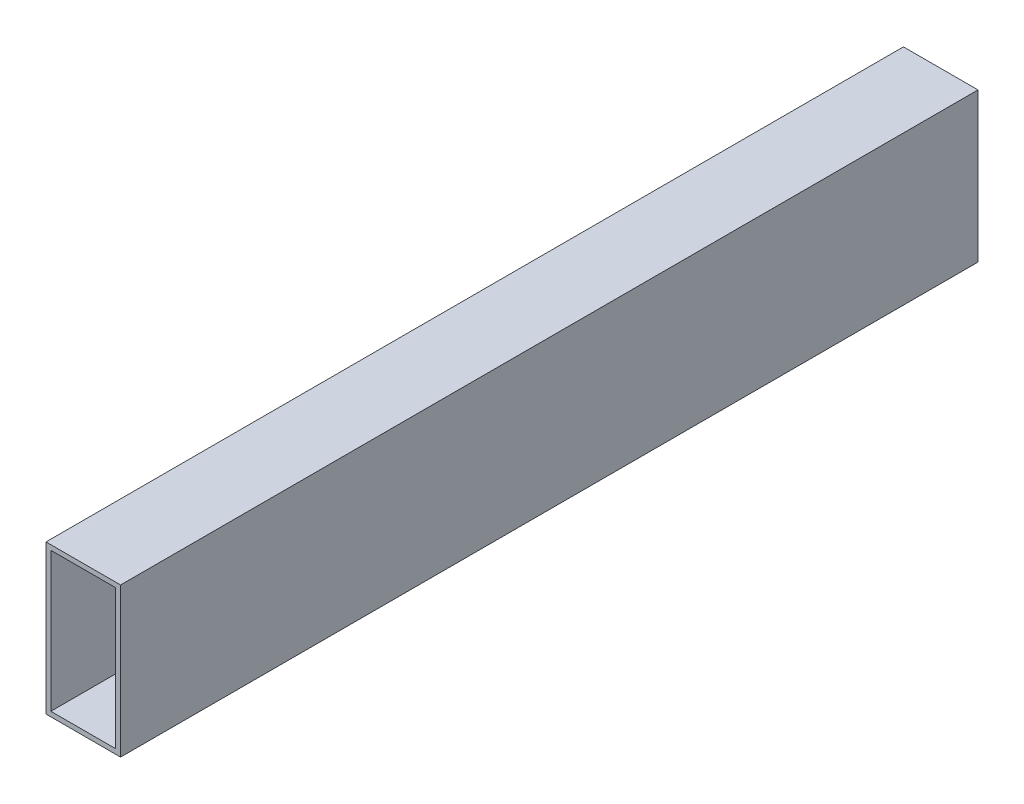
ISO-10303-21;
HEADER;
FILE_DESCRIPTION(('STEP AP214'),'2;1');
FILE_NAME('part.step','',(''),(''),'','','');
FILE_SCHEMA(('AUTOMOTIVE_DESIGN { 1 0 10303 214 1 1 1 1 }'));
ENDSEC;
DATA;
#1=APPLICATION_CONTEXT('core data for automotive mechanical design processes');
#2=APPLICATION_PROTOCOL_DEFINITION('international standard','automotive_design',2000,#1);
#3=PRODUCT_CONTEXT('',#1,'mechanical');
#4=PRODUCT('Part','Part','',(#3));
#5=PRODUCT_RELATED_PRODUCT_CATEGORY('part','',(#4));
#6=PRODUCT_DEFINITION_FORMATION('','',#4);
#7=PRODUCT_DEFINITION_CONTEXT('part definition',#1,'design');
#8=PRODUCT_DEFINITION('design','',#6,#7);
#9=PRODUCT_DEFINITION_SHAPE('','',#8);
#10=(LENGTH_UNIT() NAMED_UNIT(*) SI_UNIT(.MILLI.,.METRE.));
#11=(NAMED_UNIT(*) PLANE_ANGLE_UNIT() SI_UNIT($,.RADIAN.));
#12=(NAMED_UNIT(*) SI_UNIT($,.STERADIAN.) SOLID_ANGLE_UNIT());
#13=UNCERTAINTY_MEASURE_WITH_UNIT(LENGTH_MEASURE(1.E-05),#10,'distance_accuracy_value','');
#14=(GEOMETRIC_REPRESENTATION_CONTEXT(3) GLOBAL_UNCERTAINTY_ASSIGNED_CONTEXT((#13)) GLOBAL_UNIT_ASSIGNED_CONTEXT((#10,
#11,#12)) REPRESENTATION_CONTEXT('',''));
#15=CARTESIAN_POINT('',(0.,0.,0.));
#16=DIRECTION('',(0.,0.,1.));
#17=DIRECTION('',(1.,0.,0.));
#18=AXIS2_PLACEMENT_3D('',#15,#16,#17);
#19=CARTESIAN_POINT('',(-48.4372093023255,-30.1994186046511,292.1));
#20=DIRECTION('',(1.,0.,0.));
#21=DIRECTION('',(0.,0.,-1.));
#22=AXIS2_PLACEMENT_3D('',#19,#20,#21);
#23=PLANE('',#22);
#24=DIRECTION('',(0.,-1.,0.));
#25=VECTOR('',#24,1.);
#26=CARTESIAN_POINT('',(-48.4372093023255,-30.1994186046511,0.));
#27=LINE('',#26,#25);
#28=CARTESIAN_POINT('',(-48.4372093023255,20.6005813953489,0.));
#29=VERTEX_POINT('',#28);
#30=CARTESIAN_POINT('',(-48.4372093023255,-30.1994186046511,0.));
#31=VERTEX_POINT('',#30);
#32=EDGE_CURVE('E129',#29,#31,#27,.T.);
#33=ORIENTED_EDGE('',*,*,#32,.T.);
#34=DIRECTION('',(0.,0.,-1.));
#35=VECTOR('',#34,1.);
#36=CARTESIAN_POINT('',(-48.4372093023255,-30.1994186046511,292.1));
#37=LINE('',#36,#35);
#38=CARTESIAN_POINT('',(-48.4372093023255,-30.1994186046511,292.1));
#39=VERTEX_POINT('',#38);
#40=EDGE_CURVE('E11',#39,#31,#37,.T.);
#41=ORIENTED_EDGE('',*,*,#40,.F.);
#42=DIRECTION('',(0.,-1.,0.));
#43=VECTOR('',#42,1.);
#44=CARTESIAN_POINT('',(-48.4372093023255,-30.1994186046511,292.1));
#45=LINE('',#44,#43);
#46=CARTESIAN_POINT('',(-48.4372093023255,20.6005813953489,292.1));
#47=VERTEX_POINT('',#46);
#48=EDGE_CURVE('E133',#47,#39,#45,.T.);
#49=ORIENTED_EDGE('',*,*,#48,.F.);
#50=DIRECTION('',(0.,0.,-1.));
#51=VECTOR('',#50,1.);
#52=CARTESIAN_POINT('',(-48.4372093023255,20.6005813953489,292.1));
#53=LINE('',#52,#51);
#54=EDGE_CURVE('E143',#47,#29,#53,.T.);
#55=ORIENTED_EDGE('',*,*,#54,.T.);
#56=EDGE_LOOP('',(#33,#41,#49,#55));
#57=FACE_BOUND('',#56,.T.);
#58=ADVANCED_FACE('F32',(#57),#23,.F.);
#59=CARTESIAN_POINT('',(-48.4372093023255,-30.1994186046511,292.1));
#60=DIRECTION('',(0.,1.,0.));
#61=DIRECTION('',(0.,0.,1.));
#62=AXIS2_PLACEMENT_3D('',#59,#60,#61);
#63=PLANE('',#62);
#64=DIRECTION('',(1.,0.,0.));
#65=VECTOR('',#64,1.);
#66=CARTESIAN_POINT('',(-48.4372093023255,-30.1994186046511,0.));
#67=LINE('',#66,#65);
#68=CARTESIAN_POINT('',(-23.0372093023255,-30.1994186046511,0.));
#69=VERTEX_POINT('',#68);
#70=EDGE_CURVE('E146',#31,#69,#67,.T.);
#71=ORIENTED_EDGE('',*,*,#70,.T.);
#72=DIRECTION('',(0.,0.,-1.));
#73=VECTOR('',#72,1.);
#74=CARTESIAN_POINT('',(-23.0372093023255,-30.1994186046511,292.1));
#75=LINE('',#74,#73);
#76=CARTESIAN_POINT('',(-23.0372093023255,-30.1994186046511,292.1));
#77=VERTEX_POINT('',#76);
#78=EDGE_CURVE('E39',#77,#69,#75,.T.);
#79=ORIENTED_EDGE('',*,*,#78,.F.);
#80=DIRECTION('',(1.,0.,0.));
#81=VECTOR('',#80,1.);
#82=CARTESIAN_POINT('',(-48.4372093023255,-30.1994186046511,292.1));
#83=LINE('',#82,#81);
#84=EDGE_CURVE('E136',#39,#77,#83,.T.);
#85=ORIENTED_EDGE('',*,*,#84,.F.);
#86=ORIENTED_EDGE('',*,*,#40,.T.);
#87=EDGE_LOOP('',(#71,#79,#85,#86));
#88=FACE_BOUND('',#87,.T.);
#89=ADVANCED_FACE('F174',(#88),#63,.F.);
#90=CARTESIAN_POINT('',(-23.0372093023255,-30.1994186046511,292.1));
#91=DIRECTION('',(-1.,0.,0.));
#92=DIRECTION('',(0.,-1.,0.));
#93=AXIS2_PLACEMENT_3D('',#90,#91,#92);
#94=PLANE('',#93);
#95=DIRECTION('',(0.,1.,0.));
#96=VECTOR('',#95,1.);
#97=CARTESIAN_POINT('',(-23.0372093023255,-30.1994186046511,0.));
#98=LINE('',#97,#96);
#99=CARTESIAN_POINT('',(-23.0372093023255,20.6005813953489,0.));
#100=VERTEX_POINT('',#99);
#101=EDGE_CURVE('E148',#69,#100,#98,.T.);
#102=ORIENTED_EDGE('',*,*,#101,.T.);
#103=DIRECTION('',(0.,0.,-1.));
#104=VECTOR('',#103,1.);
#105=CARTESIAN_POINT('',(-23.0372093023255,20.6005813953489,292.1));
#106=LINE('',#105,#104);
#107=CARTESIAN_POINT('',(-23.0372093023255,20.6005813953489,292.1));
#108=VERTEX_POINT('',#107);
#109=EDGE_CURVE('E153',#108,#100,#106,.T.);
#110=ORIENTED_EDGE('',*,*,#109,.F.);
#111=DIRECTION('',(0.,1.,0.));
#112=VECTOR('',#111,1.);
#113=CARTESIAN_POINT('',(-23.0372093023255,-30.1994186046511,292.1));
#114=LINE('',#113,#112);
#115=EDGE_CURVE('E139',#77,#108,#114,.T.);
#116=ORIENTED_EDGE('',*,*,#115,.F.);
#117=ORIENTED_EDGE('',*,*,#78,.T.);
#118=EDGE_LOOP('',(#102,#110,#116,#117));
#119=FACE_BOUND('',#118,.T.);
#120=ADVANCED_FACE('F160',(#119),#94,.F.);
#121=CARTESIAN_POINT('',(-48.4372093023255,20.6005813953489,292.1));
#122=DIRECTION('',(0.,-1.,0.));
#123=DIRECTION('',(0.,0.,-1.));
#124=AXIS2_PLACEMENT_3D('',#121,#122,#123);
#125=PLANE('',#124);
#126=DIRECTION('',(-1.,0.,0.));
#127=VECTOR('',#126,1.);
#128=CARTESIAN_POINT('',(-48.4372093023255,20.6005813953489,0.));
#129=LINE('',#128,#127);
#130=EDGE_CURVE('E137',#100,#29,#129,.T.);
#131=ORIENTED_EDGE('',*,*,#130,.T.);
#132=ORIENTED_EDGE('',*,*,#54,.F.);
#133=DIRECTION('',(-1.,0.,0.));
#134=VECTOR('',#133,1.);
#135=CARTESIAN_POINT('',(-48.4372093023255,20.6005813953489,292.1));
#136=LINE('',#135,#134);
#137=EDGE_CURVE('E141',#108,#47,#136,.T.);
#138=ORIENTED_EDGE('',*,*,#137,.F.);
#139=ORIENTED_EDGE('',*,*,#109,.T.);
#140=EDGE_LOOP('',(#131,#132,#138,#139));
#141=FACE_BOUND('',#140,.T.);
#142=ADVANCED_FACE('F167',(#141),#125,.F.);
#143=CARTESIAN_POINT('',(0.,0.,292.1));
#144=DIRECTION('',(0.,0.,-1.));
#145=DIRECTION('',(-1.,0.,0.));
#146=AXIS2_PLACEMENT_3D('',#143,#144,#145);
#147=PLANE('',#146);
#148=DIRECTION('',(-1.,0.,0.));
#149=VECTOR('',#148,1.);
#150=CARTESIAN_POINT('',(-46.7862093023255,18.9495813953489,292.1));
#151=LINE('',#150,#149);
#152=CARTESIAN_POINT('',(-24.6882093023255,18.9495813953489,292.1));
#153=VERTEX_POINT('',#152);
#154=CARTESIAN_POINT('',(-46.7862093023255,18.9495813953489,292.1));
#155=VERTEX_POINT('',#154);
#156=EDGE_CURVE('E123',#153,#155,#151,.T.);
#157=ORIENTED_EDGE('',*,*,#156,.F.);
#158=DIRECTION('',(0.,1.,0.));
#159=VECTOR('',#158,1.);
#160=CARTESIAN_POINT('',(-24.6882093023255,18.9495813953489,292.1));
#161=LINE('',#160,#159);
#162=CARTESIAN_POINT('',(-24.6882093023255,-28.5484186046511,292.1));
#163=VERTEX_POINT('',#162);
#164=EDGE_CURVE('E46',#163,#153,#161,.T.);
#165=ORIENTED_EDGE('',*,*,#164,.F.);
#166=DIRECTION('',(1.,0.,0.));
#167=VECTOR('',#166,1.);
#168=CARTESIAN_POINT('',(-46.7862093023255,-28.5484186046511,292.1));
#169=LINE('',#168,#167);
#170=CARTESIAN_POINT('',(-46.7862093023255,-28.5484186046511,292.1));
#171=VERTEX_POINT('',#170);
#172=EDGE_CURVE('E114',#171,#163,#169,.T.);
#173=ORIENTED_EDGE('',*,*,#172,.F.);
#174=DIRECTION('',(0.,-1.,0.));
#175=VECTOR('',#174,1.);
#176=CARTESIAN_POINT('',(-46.7862093023255,18.9495813953489,292.1));
#177=LINE('',#176,#175);
#178=EDGE_CURVE('E117',#155,#171,#177,.T.);
#179=ORIENTED_EDGE('',*,*,#178,.F.);
#180=EDGE_LOOP('',(#157,#165,#173,#179));
#181=FACE_BOUND('',#180,.T.);
#182=ORIENTED_EDGE('',*,*,#48,.T.);
#183=ORIENTED_EDGE('',*,*,#84,.T.);
#184=ORIENTED_EDGE('',*,*,#115,.T.);
#185=ORIENTED_EDGE('',*,*,#137,.T.);
#186=EDGE_LOOP('',(#182,#183,#184,#185));
#187=FACE_BOUND('',#186,.T.);
#188=ADVANCED_FACE('F173',(#181,#187),#147,.F.);
#189=CARTESIAN_POINT('',(0.,0.,0.));
#190=DIRECTION('',(0.,0.,-1.));
#191=DIRECTION('',(-1.,0.,0.));
#192=AXIS2_PLACEMENT_3D('',#189,#190,#191);
#193=PLANE('',#192);
#194=DIRECTION('',(0.,1.,0.));
#195=VECTOR('',#194,1.);
#196=CARTESIAN_POINT('',(-24.6882093023255,18.9495813953489,0.));
#197=LINE('',#196,#195);
#198=CARTESIAN_POINT('',(-24.6882093023255,-28.5484186046511,0.));
#199=VERTEX_POINT('',#198);
#200=CARTESIAN_POINT('',(-24.6882093023255,18.9495813953489,0.));
#201=VERTEX_POINT('',#200);
#202=EDGE_CURVE('E98',#199,#201,#197,.T.);
#203=ORIENTED_EDGE('',*,*,#202,.T.);
#204=DIRECTION('',(-1.,0.,0.));
#205=VECTOR('',#204,1.);
#206=CARTESIAN_POINT('',(-46.7862093023255,18.9495813953489,0.));
#207=LINE('',#206,#205);
#208=CARTESIAN_POINT('',(-46.7862093023255,18.9495813953489,0.));
#209=VERTEX_POINT('',#208);
#210=EDGE_CURVE('E107',#201,#209,#207,.T.);
#211=ORIENTED_EDGE('',*,*,#210,.T.);
#212=DIRECTION('',(0.,-1.,0.));
#213=VECTOR('',#212,1.);
#214=CARTESIAN_POINT('',(-46.7862093023255,18.9495813953489,0.));
#215=LINE('',#214,#213);
#216=CARTESIAN_POINT('',(-46.7862093023255,-28.5484186046511,0.));
#217=VERTEX_POINT('',#216);
#218=EDGE_CURVE('E54',#209,#217,#215,.T.);
#219=ORIENTED_EDGE('',*,*,#218,.T.);
#220=DIRECTION('',(1.,0.,0.));
#221=VECTOR('',#220,1.);
#222=CARTESIAN_POINT('',(-46.7862093023255,-28.5484186046511,0.));
#223=LINE('',#222,#221);
#224=EDGE_CURVE('E104',#217,#199,#223,.T.);
#225=ORIENTED_EDGE('',*,*,#224,.T.);
#226=EDGE_LOOP('',(#203,#211,#219,#225));
#227=FACE_BOUND('',#226,.T.);
#228=ORIENTED_EDGE('',*,*,#32,.F.);
#229=ORIENTED_EDGE('',*,*,#130,.F.);
#230=ORIENTED_EDGE('',*,*,#101,.F.);
#231=ORIENTED_EDGE('',*,*,#70,.F.);
#232=EDGE_LOOP('',(#228,#229,#230,#231));
#233=FACE_BOUND('',#232,.T.);
#234=ADVANCED_FACE('F111',(#227,#233),#193,.T.);
#235=CARTESIAN_POINT('',(-24.6882093023255,18.9495813953489,0.));
#236=DIRECTION('',(1.,0.,0.));
#237=DIRECTION('',(0.,1.,0.));
#238=AXIS2_PLACEMENT_3D('',#235,#236,#237);
#239=PLANE('',#238);
#240=ORIENTED_EDGE('',*,*,#164,.T.);
#241=DIRECTION('',(0.,0.,1.));
#242=VECTOR('',#241,1.);
#243=CARTESIAN_POINT('',(-24.6882093023255,18.9495813953489,0.));
#244=LINE('',#243,#242);
#245=EDGE_CURVE('E94',#201,#153,#244,.T.);
#246=ORIENTED_EDGE('',*,*,#245,.F.);
#247=ORIENTED_EDGE('',*,*,#202,.F.);
#248=DIRECTION('',(0.,0.,1.));
#249=VECTOR('',#248,1.);
#250=CARTESIAN_POINT('',(-24.6882093023255,-28.5484186046511,0.));
#251=LINE('',#250,#249);
#252=EDGE_CURVE('E127',#199,#163,#251,.T.);
#253=ORIENTED_EDGE('',*,*,#252,.T.);
#254=EDGE_LOOP('',(#240,#246,#247,#253));
#255=FACE_BOUND('',#254,.T.);
#256=ADVANCED_FACE('F96',(#255),#239,.F.);
#257=CARTESIAN_POINT('',(-46.7862093023255,-28.5484186046511,0.));
#258=DIRECTION('',(0.,-1.,0.));
#259=DIRECTION('',(0.,0.,-1.));
#260=AXIS2_PLACEMENT_3D('',#257,#258,#259);
#261=PLANE('',#260);
#262=ORIENTED_EDGE('',*,*,#172,.T.);
#263=ORIENTED_EDGE('',*,*,#252,.F.);
#264=ORIENTED_EDGE('',*,*,#224,.F.);
#265=DIRECTION('',(0.,0.,1.));
#266=VECTOR('',#265,1.);
#267=CARTESIAN_POINT('',(-46.7862093023255,-28.5484186046511,0.));
#268=LINE('',#267,#266);
#269=EDGE_CURVE('E130',#217,#171,#268,.T.);
#270=ORIENTED_EDGE('',*,*,#269,.T.);
#271=EDGE_LOOP('',(#262,#263,#264,#270));
#272=FACE_BOUND('',#271,.T.);
#273=ADVANCED_FACE('F191',(#272),#261,.F.);
#274=CARTESIAN_POINT('',(-46.7862093023255,18.9495813953489,0.));
#275=DIRECTION('',(-1.,0.,0.));
#276=DIRECTION('',(0.,-1.,0.));
#277=AXIS2_PLACEMENT_3D('',#274,#275,#276);
#278=PLANE('',#277);
#279=ORIENTED_EDGE('',*,*,#178,.T.);
#280=ORIENTED_EDGE('',*,*,#269,.F.);
#281=ORIENTED_EDGE('',*,*,#218,.F.);
#282=DIRECTION('',(0.,0.,1.));
#283=VECTOR('',#282,1.);
#284=CARTESIAN_POINT('',(-46.7862093023255,18.9495813953489,0.));
#285=LINE('',#284,#283);
#286=EDGE_CURVE('E103',#209,#155,#285,.T.);
#287=ORIENTED_EDGE('',*,*,#286,.T.);
#288=EDGE_LOOP('',(#279,#280,#281,#287));
#289=FACE_BOUND('',#288,.T.);
#290=ADVANCED_FACE('F194',(#289),#278,.F.);
#291=CARTESIAN_POINT('',(-46.7862093023255,18.9495813953489,0.));
#292=DIRECTION('',(0.,1.,0.));
#293=DIRECTION('',(0.,0.,1.));
#294=AXIS2_PLACEMENT_3D('',#291,#292,#293);
#295=PLANE('',#294);
#296=ORIENTED_EDGE('',*,*,#156,.T.);
#297=ORIENTED_EDGE('',*,*,#286,.F.);
#298=ORIENTED_EDGE('',*,*,#210,.F.);
#299=ORIENTED_EDGE('',*,*,#245,.T.);
#300=EDGE_LOOP('',(#296,#297,#298,#299));
#301=FACE_BOUND('',#300,.T.);
#302=ADVANCED_FACE('F108',(#301),#295,.F.);
#303=CLOSED_SHELL('',(#58,#89,#120,#142,#188,#234,#256,#273,#290,#302));
#304=MANIFOLD_SOLID_BREP('B2',#303);
#305=ADVANCED_BREP_SHAPE_REPRESENTATION('',(#18,#304),#14);
#306=SHAPE_DEFINITION_REPRESENTATION(#9,#305);
ENDSEC;
END-ISO-10303-21;
